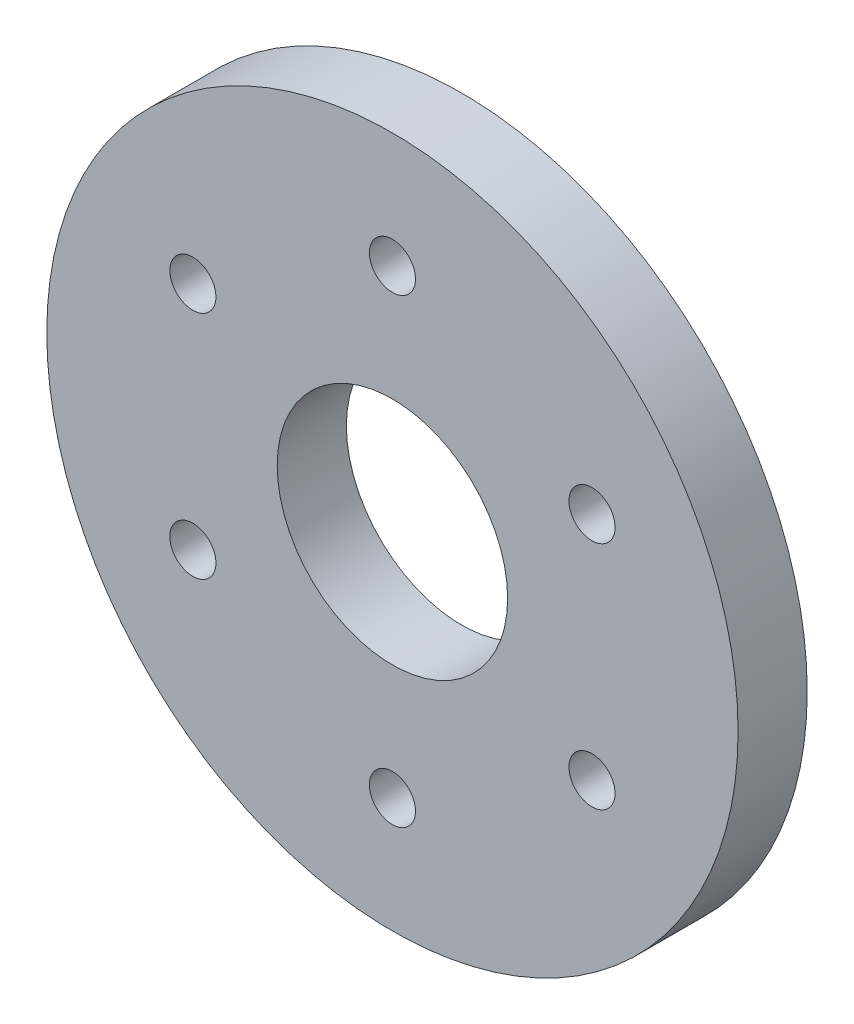
ISO-10303-21;
HEADER;
FILE_DESCRIPTION(('STEP AP214'),'2;1');
FILE_NAME('part.step','',(''),(''),'','','');
FILE_SCHEMA(('AUTOMOTIVE_DESIGN { 1 0 10303 214 1 1 1 1 }'));
ENDSEC;
DATA;
#1=APPLICATION_CONTEXT('core data for automotive mechanical design processes');
#2=APPLICATION_PROTOCOL_DEFINITION('international standard','automotive_design',2000,#1);
#3=PRODUCT_CONTEXT('',#1,'mechanical');
#4=PRODUCT('Part','Part','',(#3));
#5=PRODUCT_RELATED_PRODUCT_CATEGORY('part','',(#4));
#6=PRODUCT_DEFINITION_FORMATION('','',#4);
#7=PRODUCT_DEFINITION_CONTEXT('part definition',#1,'design');
#8=PRODUCT_DEFINITION('design','',#6,#7);
#9=PRODUCT_DEFINITION_SHAPE('','',#8);
#10=(LENGTH_UNIT() NAMED_UNIT(*) SI_UNIT(.MILLI.,.METRE.));
#11=(NAMED_UNIT(*) PLANE_ANGLE_UNIT() SI_UNIT($,.RADIAN.));
#12=(NAMED_UNIT(*) SI_UNIT($,.STERADIAN.) SOLID_ANGLE_UNIT());
#13=UNCERTAINTY_MEASURE_WITH_UNIT(LENGTH_MEASURE(1.E-05),#10,'distance_accuracy_value','');
#14=(GEOMETRIC_REPRESENTATION_CONTEXT(3) GLOBAL_UNCERTAINTY_ASSIGNED_CONTEXT((#13)) GLOBAL_UNIT_ASSIGNED_CONTEXT((#10,
#11,#12)) REPRESENTATION_CONTEXT('',''));
#15=CARTESIAN_POINT('',(0.,0.,0.));
#16=DIRECTION('',(0.,0.,1.));
#17=DIRECTION('',(1.,0.,0.));
#18=AXIS2_PLACEMENT_3D('',#15,#16,#17);
#19=CARTESIAN_POINT('',(0.,0.,6.));
#20=DIRECTION('',(0.,0.,1.));
#21=DIRECTION('',(1.,0.,0.));
#22=AXIS2_PLACEMENT_3D('',#19,#20,#21);
#23=PLANE('',#22);
#24=CARTESIAN_POINT('',(-17.3205080756872,-10.0000000000009,6.));
#25=DIRECTION('',(0.,0.,1.));
#26=DIRECTION('',(1.,0.,0.));
#27=AXIS2_PLACEMENT_3D('',#24,#25,#26);
#28=CIRCLE('',#27,2.);
#29=CARTESIAN_POINT('',(-15.3205080756872,-10.0000000000009,6.));
#30=VERTEX_POINT('',#29);
#31=EDGE_CURVE('E75',#30,#30,#28,.T.);
#32=ORIENTED_EDGE('',*,*,#31,.F.);
#33=EDGE_LOOP('',(#32));
#34=FACE_BOUND('',#33,.T.);
#35=CARTESIAN_POINT('',(17.3205080756904,-9.99999999999908,6.));
#36=DIRECTION('',(0.,0.,1.));
#37=DIRECTION('',(1.,0.,0.));
#38=AXIS2_PLACEMENT_3D('',#35,#36,#37);
#39=CIRCLE('',#38,2.);
#40=CARTESIAN_POINT('',(19.3205080756904,-9.99999999999908,6.));
#41=VERTEX_POINT('',#40);
#42=EDGE_CURVE('E63',#41,#41,#39,.T.);
#43=ORIENTED_EDGE('',*,*,#42,.F.);
#44=EDGE_LOOP('',(#43));
#45=FACE_BOUND('',#44,.T.);
#46=CARTESIAN_POINT('',(0.,20.,6.));
#47=DIRECTION('',(0.,0.,1.));
#48=DIRECTION('',(1.,0.,0.));
#49=AXIS2_PLACEMENT_3D('',#46,#47,#48);
#50=CIRCLE('',#49,2.);
#51=CARTESIAN_POINT('',(2.,20.,6.));
#52=VERTEX_POINT('',#51);
#53=EDGE_CURVE('E51',#52,#52,#50,.T.);
#54=ORIENTED_EDGE('',*,*,#53,.F.);
#55=EDGE_LOOP('',(#54));
#56=FACE_BOUND('',#55,.T.);
#57=CARTESIAN_POINT('',(0.,0.,6.));
#58=DIRECTION('',(0.,0.,1.));
#59=DIRECTION('',(1.,0.,0.));
#60=AXIS2_PLACEMENT_3D('',#57,#58,#59);
#61=CIRCLE('',#60,30.);
#62=CARTESIAN_POINT('',(30.,0.,6.));
#63=VERTEX_POINT('',#62);
#64=EDGE_CURVE('E10',#63,#63,#61,.T.);
#65=ORIENTED_EDGE('',*,*,#64,.T.);
#66=EDGE_LOOP('',(#65));
#67=FACE_BOUND('',#66,.T.);
#68=CARTESIAN_POINT('',(0.,0.,6.));
#69=DIRECTION('',(0.,0.,1.));
#70=DIRECTION('',(1.,0.,0.));
#71=AXIS2_PLACEMENT_3D('',#68,#69,#70);
#72=CIRCLE('',#71,10.);
#73=CARTESIAN_POINT('',(10.,0.,6.));
#74=VERTEX_POINT('',#73);
#75=EDGE_CURVE('E46',#74,#74,#72,.T.);
#76=ORIENTED_EDGE('',*,*,#75,.F.);
#77=EDGE_LOOP('',(#76));
#78=FACE_BOUND('',#77,.T.);
#79=CARTESIAN_POINT('',(17.3205080756893,10.0000000000009,6.));
#80=DIRECTION('',(0.,0.,1.));
#81=DIRECTION('',(1.,0.,0.));
#82=AXIS2_PLACEMENT_3D('',#79,#80,#81);
#83=CIRCLE('',#82,2.);
#84=CARTESIAN_POINT('',(19.3205080756893,10.0000000000009,6.));
#85=VERTEX_POINT('',#84);
#86=EDGE_CURVE('E57',#85,#85,#83,.T.);
#87=ORIENTED_EDGE('',*,*,#86,.F.);
#88=EDGE_LOOP('',(#87));
#89=FACE_BOUND('',#88,.T.);
#90=CARTESIAN_POINT('',(2.12183103288712E-12,-20.,6.));
#91=DIRECTION('',(0.,0.,1.));
#92=DIRECTION('',(1.,0.,0.));
#93=AXIS2_PLACEMENT_3D('',#90,#91,#92);
#94=CIRCLE('',#93,2.);
#95=CARTESIAN_POINT('',(2.00000000000212,-20.,6.));
#96=VERTEX_POINT('',#95);
#97=EDGE_CURVE('E69',#96,#96,#94,.T.);
#98=ORIENTED_EDGE('',*,*,#97,.F.);
#99=EDGE_LOOP('',(#98));
#100=FACE_BOUND('',#99,.T.);
#101=CARTESIAN_POINT('',(-17.3205080756883,9.99999999999907,6.));
#102=DIRECTION('',(0.,0.,1.));
#103=DIRECTION('',(1.,0.,0.));
#104=AXIS2_PLACEMENT_3D('',#101,#102,#103);
#105=CIRCLE('',#104,2.);
#106=CARTESIAN_POINT('',(-15.3205080756883,9.99999999999907,6.));
#107=VERTEX_POINT('',#106);
#108=EDGE_CURVE('E81',#107,#107,#105,.T.);
#109=ORIENTED_EDGE('',*,*,#108,.F.);
#110=EDGE_LOOP('',(#109));
#111=FACE_BOUND('',#110,.T.);
#112=ADVANCED_FACE('F35',(#34,#45,#56,#67,#78,#89,#100,#111),#23,.T.);
#113=CARTESIAN_POINT('',(0.,0.,0.));
#114=DIRECTION('',(0.,0.,1.));
#115=DIRECTION('',(1.,0.,0.));
#116=AXIS2_PLACEMENT_3D('',#113,#114,#115);
#117=PLANE('',#116);
#118=CARTESIAN_POINT('',(0.,0.,0.));
#119=DIRECTION('',(0.,0.,1.));
#120=DIRECTION('',(1.,0.,0.));
#121=AXIS2_PLACEMENT_3D('',#118,#119,#120);
#122=CIRCLE('',#121,30.);
#123=CARTESIAN_POINT('',(30.,0.,0.));
#124=VERTEX_POINT('',#123);
#125=EDGE_CURVE('E39',#124,#124,#122,.T.);
#126=ORIENTED_EDGE('',*,*,#125,.F.);
#127=EDGE_LOOP('',(#126));
#128=FACE_BOUND('',#127,.T.);
#129=CARTESIAN_POINT('',(0.,0.,0.));
#130=DIRECTION('',(0.,0.,1.));
#131=DIRECTION('',(1.,0.,0.));
#132=AXIS2_PLACEMENT_3D('',#129,#130,#131);
#133=CIRCLE('',#132,10.);
#134=CARTESIAN_POINT('',(10.,0.,0.));
#135=VERTEX_POINT('',#134);
#136=EDGE_CURVE('E48',#135,#135,#133,.T.);
#137=ORIENTED_EDGE('',*,*,#136,.T.);
#138=EDGE_LOOP('',(#137));
#139=FACE_BOUND('',#138,.T.);
#140=CARTESIAN_POINT('',(0.,20.,0.));
#141=DIRECTION('',(0.,0.,1.));
#142=DIRECTION('',(1.,0.,0.));
#143=AXIS2_PLACEMENT_3D('',#140,#141,#142);
#144=CIRCLE('',#143,2.);
#145=CARTESIAN_POINT('',(2.,20.,0.));
#146=VERTEX_POINT('',#145);
#147=EDGE_CURVE('E54',#146,#146,#144,.T.);
#148=ORIENTED_EDGE('',*,*,#147,.T.);
#149=EDGE_LOOP('',(#148));
#150=FACE_BOUND('',#149,.T.);
#151=CARTESIAN_POINT('',(17.3205080756893,10.0000000000009,0.));
#152=DIRECTION('',(0.,0.,1.));
#153=DIRECTION('',(1.,0.,0.));
#154=AXIS2_PLACEMENT_3D('',#151,#152,#153);
#155=CIRCLE('',#154,2.);
#156=CARTESIAN_POINT('',(19.3205080756893,10.0000000000009,0.));
#157=VERTEX_POINT('',#156);
#158=EDGE_CURVE('E60',#157,#157,#155,.T.);
#159=ORIENTED_EDGE('',*,*,#158,.T.);
#160=EDGE_LOOP('',(#159));
#161=FACE_BOUND('',#160,.T.);
#162=CARTESIAN_POINT('',(17.3205080756904,-9.99999999999908,0.));
#163=DIRECTION('',(0.,0.,1.));
#164=DIRECTION('',(1.,0.,0.));
#165=AXIS2_PLACEMENT_3D('',#162,#163,#164);
#166=CIRCLE('',#165,2.);
#167=CARTESIAN_POINT('',(19.3205080756904,-9.99999999999908,0.));
#168=VERTEX_POINT('',#167);
#169=EDGE_CURVE('E66',#168,#168,#166,.T.);
#170=ORIENTED_EDGE('',*,*,#169,.T.);
#171=EDGE_LOOP('',(#170));
#172=FACE_BOUND('',#171,.T.);
#173=CARTESIAN_POINT('',(2.12183103288712E-12,-20.,0.));
#174=DIRECTION('',(0.,0.,1.));
#175=DIRECTION('',(1.,0.,0.));
#176=AXIS2_PLACEMENT_3D('',#173,#174,#175);
#177=CIRCLE('',#176,2.);
#178=CARTESIAN_POINT('',(2.00000000000212,-20.,0.));
#179=VERTEX_POINT('',#178);
#180=EDGE_CURVE('E72',#179,#179,#177,.T.);
#181=ORIENTED_EDGE('',*,*,#180,.T.);
#182=EDGE_LOOP('',(#181));
#183=FACE_BOUND('',#182,.T.);
#184=CARTESIAN_POINT('',(-17.3205080756872,-10.0000000000009,0.));
#185=DIRECTION('',(0.,0.,1.));
#186=DIRECTION('',(1.,0.,0.));
#187=AXIS2_PLACEMENT_3D('',#184,#185,#186);
#188=CIRCLE('',#187,2.);
#189=CARTESIAN_POINT('',(-15.3205080756872,-10.0000000000009,0.));
#190=VERTEX_POINT('',#189);
#191=EDGE_CURVE('E78',#190,#190,#188,.T.);
#192=ORIENTED_EDGE('',*,*,#191,.T.);
#193=EDGE_LOOP('',(#192));
#194=FACE_BOUND('',#193,.T.);
#195=CARTESIAN_POINT('',(-17.3205080756883,9.99999999999907,0.));
#196=DIRECTION('',(0.,0.,1.));
#197=DIRECTION('',(1.,0.,0.));
#198=AXIS2_PLACEMENT_3D('',#195,#196,#197);
#199=CIRCLE('',#198,2.);
#200=CARTESIAN_POINT('',(-15.3205080756883,9.99999999999907,0.));
#201=VERTEX_POINT('',#200);
#202=EDGE_CURVE('E84',#201,#201,#199,.T.);
#203=ORIENTED_EDGE('',*,*,#202,.T.);
#204=EDGE_LOOP('',(#203));
#205=FACE_BOUND('',#204,.T.);
#206=ADVANCED_FACE('F94',(#128,#139,#150,#161,#172,#183,#194,#205),#117,.F.);
#207=CARTESIAN_POINT('',(0.,0.,6.));
#208=DIRECTION('',(0.,0.,-1.));
#209=DIRECTION('',(-1.,0.,0.));
#210=AXIS2_PLACEMENT_3D('',#207,#208,#209);
#211=CYLINDRICAL_SURFACE('',#210,30.);
#212=ORIENTED_EDGE('',*,*,#64,.F.);
#213=EDGE_LOOP('',(#212));
#214=FACE_BOUND('',#213,.T.);
#215=ORIENTED_EDGE('',*,*,#125,.T.);
#216=EDGE_LOOP('',(#215));
#217=FACE_BOUND('',#216,.T.);
#218=ADVANCED_FACE('F37',(#214,#217),#211,.T.);
#219=CARTESIAN_POINT('',(0.,0.,6.));
#220=DIRECTION('',(0.,0.,-1.));
#221=DIRECTION('',(-1.,0.,0.));
#222=AXIS2_PLACEMENT_3D('',#219,#220,#221);
#223=CYLINDRICAL_SURFACE('',#222,10.);
#224=ORIENTED_EDGE('',*,*,#75,.T.);
#225=EDGE_LOOP('',(#224));
#226=FACE_BOUND('',#225,.T.);
#227=ORIENTED_EDGE('',*,*,#136,.F.);
#228=EDGE_LOOP('',(#227));
#229=FACE_BOUND('',#228,.T.);
#230=ADVANCED_FACE('F104',(#226,#229),#223,.F.);
#231=CARTESIAN_POINT('',(0.,20.,6.));
#232=DIRECTION('',(0.,0.,-1.));
#233=DIRECTION('',(-1.,0.,0.));
#234=AXIS2_PLACEMENT_3D('',#231,#232,#233);
#235=CYLINDRICAL_SURFACE('',#234,2.);
#236=ORIENTED_EDGE('',*,*,#53,.T.);
#237=EDGE_LOOP('',(#236));
#238=FACE_BOUND('',#237,.T.);
#239=ORIENTED_EDGE('',*,*,#147,.F.);
#240=EDGE_LOOP('',(#239));
#241=FACE_BOUND('',#240,.T.);
#242=ADVANCED_FACE('F107',(#238,#241),#235,.F.);
#243=CARTESIAN_POINT('',(17.3205080756893,10.0000000000009,6.));
#244=DIRECTION('',(0.,0.,-1.));
#245=DIRECTION('',(-1.,0.,0.));
#246=AXIS2_PLACEMENT_3D('',#243,#244,#245);
#247=CYLINDRICAL_SURFACE('',#246,2.);
#248=ORIENTED_EDGE('',*,*,#86,.T.);
#249=EDGE_LOOP('',(#248));
#250=FACE_BOUND('',#249,.T.);
#251=ORIENTED_EDGE('',*,*,#158,.F.);
#252=EDGE_LOOP('',(#251));
#253=FACE_BOUND('',#252,.T.);
#254=ADVANCED_FACE('F111',(#250,#253),#247,.F.);
#255=CARTESIAN_POINT('',(17.3205080756904,-9.99999999999908,6.));
#256=DIRECTION('',(0.,0.,-1.));
#257=DIRECTION('',(-1.,0.,0.));
#258=AXIS2_PLACEMENT_3D('',#255,#256,#257);
#259=CYLINDRICAL_SURFACE('',#258,2.);
#260=ORIENTED_EDGE('',*,*,#42,.T.);
#261=EDGE_LOOP('',(#260));
#262=FACE_BOUND('',#261,.T.);
#263=ORIENTED_EDGE('',*,*,#169,.F.);
#264=EDGE_LOOP('',(#263));
#265=FACE_BOUND('',#264,.T.);
#266=ADVANCED_FACE('F115',(#262,#265),#259,.F.);
#267=CARTESIAN_POINT('',(2.12183103288712E-12,-20.,6.));
#268=DIRECTION('',(0.,0.,-1.));
#269=DIRECTION('',(-1.,0.,0.));
#270=AXIS2_PLACEMENT_3D('',#267,#268,#269);
#271=CYLINDRICAL_SURFACE('',#270,2.);
#272=ORIENTED_EDGE('',*,*,#97,.T.);
#273=EDGE_LOOP('',(#272));
#274=FACE_BOUND('',#273,.T.);
#275=ORIENTED_EDGE('',*,*,#180,.F.);
#276=EDGE_LOOP('',(#275));
#277=FACE_BOUND('',#276,.T.);
#278=ADVANCED_FACE('F119',(#274,#277),#271,.F.);
#279=CARTESIAN_POINT('',(-17.3205080756872,-10.0000000000009,6.));
#280=DIRECTION('',(0.,0.,-1.));
#281=DIRECTION('',(-1.,0.,0.));
#282=AXIS2_PLACEMENT_3D('',#279,#280,#281);
#283=CYLINDRICAL_SURFACE('',#282,2.);
#284=ORIENTED_EDGE('',*,*,#31,.T.);
#285=EDGE_LOOP('',(#284));
#286=FACE_BOUND('',#285,.T.);
#287=ORIENTED_EDGE('',*,*,#191,.F.);
#288=EDGE_LOOP('',(#287));
#289=FACE_BOUND('',#288,.T.);
#290=ADVANCED_FACE('F123',(#286,#289),#283,.F.);
#291=CARTESIAN_POINT('',(-17.3205080756883,9.99999999999907,6.));
#292=DIRECTION('',(0.,0.,-1.));
#293=DIRECTION('',(-1.,0.,0.));
#294=AXIS2_PLACEMENT_3D('',#291,#292,#293);
#295=CYLINDRICAL_SURFACE('',#294,2.);
#296=ORIENTED_EDGE('',*,*,#108,.T.);
#297=EDGE_LOOP('',(#296));
#298=FACE_BOUND('',#297,.T.);
#299=ORIENTED_EDGE('',*,*,#202,.F.);
#300=EDGE_LOOP('',(#299));
#301=FACE_BOUND('',#300,.T.);
#302=ADVANCED_FACE('F90',(#298,#301),#295,.F.);
#303=CLOSED_SHELL('',(#112,#206,#218,#230,#242,#254,#266,#278,#290,#302));
#304=MANIFOLD_SOLID_BREP('B2',#303);
#305=ADVANCED_BREP_SHAPE_REPRESENTATION('',(#18,#304),#14);
#306=SHAPE_DEFINITION_REPRESENTATION(#9,#305);
ENDSEC;
END-ISO-10303-21;
